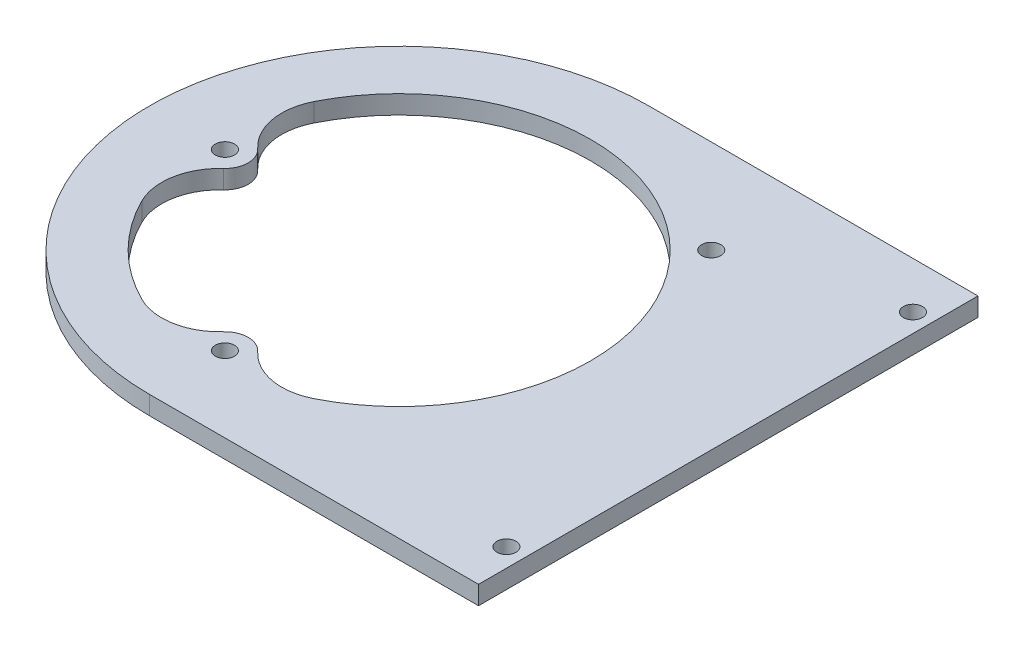
ISO-10303-21;
HEADER;
FILE_DESCRIPTION(('STEP AP214'),'2;1');
FILE_NAME('part.step','',(''),(''),'','','');
FILE_SCHEMA(('AUTOMOTIVE_DESIGN { 1 0 10303 214 1 1 1 1 }'));
ENDSEC;
DATA;
#1=APPLICATION_CONTEXT('core data for automotive mechanical design processes');
#2=APPLICATION_PROTOCOL_DEFINITION('international standard','automotive_design',2000,#1);
#3=PRODUCT_CONTEXT('',#1,'mechanical');
#4=PRODUCT('Part','Part','',(#3));
#5=PRODUCT_RELATED_PRODUCT_CATEGORY('part','',(#4));
#6=PRODUCT_DEFINITION_FORMATION('','',#4);
#7=PRODUCT_DEFINITION_CONTEXT('part definition',#1,'design');
#8=PRODUCT_DEFINITION('design','',#6,#7);
#9=PRODUCT_DEFINITION_SHAPE('','',#8);
#10=(LENGTH_UNIT() NAMED_UNIT(*) SI_UNIT(.MILLI.,.METRE.));
#11=(NAMED_UNIT(*) PLANE_ANGLE_UNIT() SI_UNIT($,.RADIAN.));
#12=(NAMED_UNIT(*) SI_UNIT($,.STERADIAN.) SOLID_ANGLE_UNIT());
#13=UNCERTAINTY_MEASURE_WITH_UNIT(LENGTH_MEASURE(1.E-05),#10,'distance_accuracy_value','');
#14=(GEOMETRIC_REPRESENTATION_CONTEXT(3) GLOBAL_UNCERTAINTY_ASSIGNED_CONTEXT((#13)) GLOBAL_UNIT_ASSIGNED_CONTEXT((#10,
#11,#12)) REPRESENTATION_CONTEXT('',''));
#15=CARTESIAN_POINT('',(0.,0.,0.));
#16=DIRECTION('',(0.,0.,1.));
#17=DIRECTION('',(1.,0.,0.));
#18=AXIS2_PLACEMENT_3D('',#15,#16,#17);
#19=CARTESIAN_POINT('',(0.,3.2,0.));
#20=DIRECTION('',(0.,1.,0.));
#21=DIRECTION('',(0.,0.,1.));
#22=AXIS2_PLACEMENT_3D('',#19,#20,#21);
#23=PLANE('',#22);
#24=CARTESIAN_POINT('',(53.47,3.2,35.));
#25=DIRECTION('',(0.,1.,0.));
#26=DIRECTION('',(0.,0.,-1.));
#27=AXIS2_PLACEMENT_3D('',#24,#25,#26);
#28=CIRCLE('',#27,1.65);
#29=CARTESIAN_POINT('',(53.47,3.2,33.35));
#30=VERTEX_POINT('',#29);
#31=EDGE_CURVE('E361',#30,#30,#28,.T.);
#32=ORIENTED_EDGE('',*,*,#31,.F.);
#33=EDGE_LOOP('',(#32));
#34=FACE_BOUND('',#33,.T.);
#35=CARTESIAN_POINT('',(-30.,3.2,0.));
#36=DIRECTION('',(0.,-1.,0.));
#37=DIRECTION('',(0.,0.,-1.));
#38=AXIS2_PLACEMENT_3D('',#35,#36,#37);
#39=CIRCLE('',#38,4.);
#40=CARTESIAN_POINT('',(-27.3,3.2,-2.95127091267474));
#41=VERTEX_POINT('',#40);
#42=CARTESIAN_POINT('',(-27.3,3.2,2.95127091267474));
#43=VERTEX_POINT('',#42);
#44=EDGE_CURVE('E239',#41,#43,#39,.T.);
#45=ORIENTED_EDGE('',*,*,#44,.F.);
#46=CARTESIAN_POINT('',(-20.55,3.2,-10.3294481943616));
#47=DIRECTION('',(0.,1.,0.));
#48=DIRECTION('',(0.,0.,1.));
#49=AXIS2_PLACEMENT_3D('',#46,#47,#48);
#50=CIRCLE('',#49,10.);
#51=CARTESIAN_POINT('',(-29.4847826086956,3.2,-14.8205126266927));
#52=VERTEX_POINT('',#51);
#53=EDGE_CURVE('E193',#41,#52,#50,.F.);
#54=ORIENTED_EDGE('',*,*,#53,.T.);
#55=CARTESIAN_POINT('',(0.,3.2,0.));
#56=DIRECTION('',(0.,1.,0.));
#57=DIRECTION('',(0.,0.,-1.));
#58=AXIS2_PLACEMENT_3D('',#55,#56,#57);
#59=CIRCLE('',#58,33.);
#60=CARTESIAN_POINT('',(14.8205126266927,3.2,29.4847826086957));
#61=VERTEX_POINT('',#60);
#62=EDGE_CURVE('E224',#61,#52,#59,.T.);
#63=ORIENTED_EDGE('',*,*,#62,.F.);
#64=CARTESIAN_POINT('',(10.3294481943616,3.2,20.55));
#65=DIRECTION('',(0.,1.,0.));
#66=DIRECTION('',(0.,0.,1.));
#67=AXIS2_PLACEMENT_3D('',#64,#65,#66);
#68=CIRCLE('',#67,10.);
#69=CARTESIAN_POINT('',(2.95127091267474,3.2,27.3));
#70=VERTEX_POINT('',#69);
#71=EDGE_CURVE('E11',#61,#70,#68,.F.);
#72=ORIENTED_EDGE('',*,*,#71,.T.);
#73=CARTESIAN_POINT('',(0.,3.2,30.));
#74=DIRECTION('',(0.,-1.,0.));
#75=DIRECTION('',(0.,0.,-1.));
#76=AXIS2_PLACEMENT_3D('',#73,#74,#75);
#77=CIRCLE('',#76,4.);
#78=CARTESIAN_POINT('',(-2.95127091267474,3.2,27.3));
#79=VERTEX_POINT('',#78);
#80=EDGE_CURVE('E227',#79,#70,#77,.T.);
#81=ORIENTED_EDGE('',*,*,#80,.F.);
#82=CARTESIAN_POINT('',(-10.3294481943616,3.2,20.55));
#83=DIRECTION('',(0.,1.,0.));
#84=DIRECTION('',(0.,0.,1.));
#85=AXIS2_PLACEMENT_3D('',#82,#83,#84);
#86=CIRCLE('',#85,10.);
#87=CARTESIAN_POINT('',(-14.8205126266927,3.2,29.4847826086956));
#88=VERTEX_POINT('',#87);
#89=EDGE_CURVE('E205',#79,#88,#86,.F.);
#90=ORIENTED_EDGE('',*,*,#89,.T.);
#91=CARTESIAN_POINT('',(0.,3.2,0.));
#92=DIRECTION('',(0.,1.,0.));
#93=DIRECTION('',(0.,0.,-1.));
#94=AXIS2_PLACEMENT_3D('',#91,#92,#93);
#95=CIRCLE('',#94,33.);
#96=CARTESIAN_POINT('',(-29.4847826086957,3.2,14.8205126266927));
#97=VERTEX_POINT('',#96);
#98=EDGE_CURVE('E231',#97,#88,#95,.T.);
#99=ORIENTED_EDGE('',*,*,#98,.F.);
#100=CARTESIAN_POINT('',(-20.55,3.2,10.3294481943616));
#101=DIRECTION('',(0.,1.,0.));
#102=DIRECTION('',(0.,0.,1.));
#103=AXIS2_PLACEMENT_3D('',#100,#101,#102);
#104=CIRCLE('',#103,10.);
#105=EDGE_CURVE('E199',#97,#43,#104,.F.);
#106=ORIENTED_EDGE('',*,*,#105,.T.);
#107=EDGE_LOOP('',(#45,#54,#63,#72,#81,#90,#99,#106));
#108=FACE_BOUND('',#107,.T.);
#109=CARTESIAN_POINT('',(0.,3.2,30.));
#110=DIRECTION('',(0.,1.,0.));
#111=DIRECTION('',(0.,0.,1.));
#112=AXIS2_PLACEMENT_3D('',#109,#110,#111);
#113=CIRCLE('',#112,1.65);
#114=CARTESIAN_POINT('',(0.,3.2,31.65));
#115=VERTEX_POINT('',#114);
#116=EDGE_CURVE('E236',#115,#115,#113,.T.);
#117=ORIENTED_EDGE('',*,*,#116,.F.);
#118=EDGE_LOOP('',(#117));
#119=FACE_BOUND('',#118,.T.);
#120=CARTESIAN_POINT('',(0.,3.2,0.));
#121=DIRECTION('',(0.,1.,0.));
#122=DIRECTION('',(0.,0.,1.));
#123=AXIS2_PLACEMENT_3D('',#120,#121,#122);
#124=CIRCLE('',#123,43.);
#125=CARTESIAN_POINT('',(0.,3.2,-43.));
#126=VERTEX_POINT('',#125);
#127=CARTESIAN_POINT('',(0.,3.2,43.));
#128=VERTEX_POINT('',#127);
#129=EDGE_CURVE('E141',#126,#128,#124,.T.);
#130=ORIENTED_EDGE('',*,*,#129,.T.);
#131=DIRECTION('',(1.,0.,0.));
#132=VECTOR('',#131,1.);
#133=CARTESIAN_POINT('',(0.,3.2,43.));
#134=LINE('',#133,#132);
#135=CARTESIAN_POINT('',(56.67,3.2,43.));
#136=VERTEX_POINT('',#135);
#137=EDGE_CURVE('E129',#128,#136,#134,.T.);
#138=ORIENTED_EDGE('',*,*,#137,.T.);
#139=DIRECTION('',(0.,0.,-1.));
#140=VECTOR('',#139,1.);
#141=CARTESIAN_POINT('',(56.67,3.2,43.));
#142=LINE('',#141,#140);
#143=CARTESIAN_POINT('',(56.67,3.2,-43.));
#144=VERTEX_POINT('',#143);
#145=EDGE_CURVE('E140',#136,#144,#142,.T.);
#146=ORIENTED_EDGE('',*,*,#145,.T.);
#147=DIRECTION('',(-1.,0.,0.));
#148=VECTOR('',#147,1.);
#149=CARTESIAN_POINT('',(56.67,3.2,-43.));
#150=LINE('',#149,#148);
#151=EDGE_CURVE('E146',#144,#126,#150,.T.);
#152=ORIENTED_EDGE('',*,*,#151,.T.);
#153=EDGE_LOOP('',(#130,#138,#146,#152));
#154=FACE_BOUND('',#153,.T.);
#155=CARTESIAN_POINT('',(26.8700576850888,3.2,-26.8700576850889));
#156=DIRECTION('',(0.,1.,0.));
#157=DIRECTION('',(0.,0.,1.));
#158=AXIS2_PLACEMENT_3D('',#155,#156,#157);
#159=CIRCLE('',#158,1.65);
#160=CARTESIAN_POINT('',(26.8700576850888,3.2,-25.2200576850889));
#161=VERTEX_POINT('',#160);
#162=EDGE_CURVE('E258',#161,#161,#159,.T.);
#163=ORIENTED_EDGE('',*,*,#162,.F.);
#164=EDGE_LOOP('',(#163));
#165=FACE_BOUND('',#164,.T.);
#166=CARTESIAN_POINT('',(53.47,3.2,-35.));
#167=DIRECTION('',(0.,1.,0.));
#168=DIRECTION('',(0.,0.,1.));
#169=AXIS2_PLACEMENT_3D('',#166,#167,#168);
#170=CIRCLE('',#169,1.65);
#171=CARTESIAN_POINT('',(53.47,3.2,-33.35));
#172=VERTEX_POINT('',#171);
#173=EDGE_CURVE('E248',#172,#172,#170,.T.);
#174=ORIENTED_EDGE('',*,*,#173,.F.);
#175=EDGE_LOOP('',(#174));
#176=FACE_BOUND('',#175,.T.);
#177=CARTESIAN_POINT('',(-30.,3.2,0.));
#178=DIRECTION('',(0.,1.,0.));
#179=DIRECTION('',(0.,0.,-1.));
#180=AXIS2_PLACEMENT_3D('',#177,#178,#179);
#181=CIRCLE('',#180,1.65);
#182=CARTESIAN_POINT('',(-30.,3.2,-1.65));
#183=VERTEX_POINT('',#182);
#184=EDGE_CURVE('E350',#183,#183,#181,.T.);
#185=ORIENTED_EDGE('',*,*,#184,.F.);
#186=EDGE_LOOP('',(#185));
#187=FACE_BOUND('',#186,.T.);
#188=ADVANCED_FACE('F39',(#34,#108,#119,#154,#165,#176,#187),#23,.T.);
#189=CARTESIAN_POINT('',(0.,0.,0.));
#190=DIRECTION('',(0.,1.,0.));
#191=DIRECTION('',(0.,0.,1.));
#192=AXIS2_PLACEMENT_3D('',#189,#190,#191);
#193=PLANE('',#192);
#194=CARTESIAN_POINT('',(0.,0.,30.));
#195=DIRECTION('',(0.,1.,0.));
#196=DIRECTION('',(0.,0.,1.));
#197=AXIS2_PLACEMENT_3D('',#194,#195,#196);
#198=CIRCLE('',#197,1.65);
#199=CARTESIAN_POINT('',(0.,0.,31.65));
#200=VERTEX_POINT('',#199);
#201=EDGE_CURVE('E230',#200,#200,#198,.T.);
#202=ORIENTED_EDGE('',*,*,#201,.T.);
#203=EDGE_LOOP('',(#202));
#204=FACE_BOUND('',#203,.T.);
#205=CARTESIAN_POINT('',(26.8700576850888,0.,-26.8700576850889));
#206=DIRECTION('',(0.,1.,0.));
#207=DIRECTION('',(0.,0.,1.));
#208=AXIS2_PLACEMENT_3D('',#205,#206,#207);
#209=CIRCLE('',#208,1.65);
#210=CARTESIAN_POINT('',(26.8700576850888,0.,-25.2200576850889));
#211=VERTEX_POINT('',#210);
#212=EDGE_CURVE('E256',#211,#211,#209,.T.);
#213=ORIENTED_EDGE('',*,*,#212,.T.);
#214=EDGE_LOOP('',(#213));
#215=FACE_BOUND('',#214,.T.);
#216=CARTESIAN_POINT('',(0.,0.,0.));
#217=DIRECTION('',(0.,1.,0.));
#218=DIRECTION('',(0.,0.,1.));
#219=AXIS2_PLACEMENT_3D('',#216,#217,#218);
#220=CIRCLE('',#219,43.);
#221=CARTESIAN_POINT('',(0.,0.,-43.));
#222=VERTEX_POINT('',#221);
#223=CARTESIAN_POINT('',(0.,0.,43.));
#224=VERTEX_POINT('',#223);
#225=EDGE_CURVE('E155',#222,#224,#220,.T.);
#226=ORIENTED_EDGE('',*,*,#225,.F.);
#227=DIRECTION('',(-1.,0.,0.));
#228=VECTOR('',#227,1.);
#229=CARTESIAN_POINT('',(56.67,0.,-43.));
#230=LINE('',#229,#228);
#231=CARTESIAN_POINT('',(56.67,0.,-43.));
#232=VERTEX_POINT('',#231);
#233=EDGE_CURVE('E151',#232,#222,#230,.T.);
#234=ORIENTED_EDGE('',*,*,#233,.F.);
#235=DIRECTION('',(0.,0.,-1.));
#236=VECTOR('',#235,1.);
#237=CARTESIAN_POINT('',(56.67,0.,43.));
#238=LINE('',#237,#236);
#239=CARTESIAN_POINT('',(56.67,0.,43.));
#240=VERTEX_POINT('',#239);
#241=EDGE_CURVE('E275',#240,#232,#238,.T.);
#242=ORIENTED_EDGE('',*,*,#241,.F.);
#243=DIRECTION('',(1.,0.,0.));
#244=VECTOR('',#243,1.);
#245=CARTESIAN_POINT('',(0.,0.,43.));
#246=LINE('',#245,#244);
#247=EDGE_CURVE('E272',#224,#240,#246,.T.);
#248=ORIENTED_EDGE('',*,*,#247,.F.);
#249=EDGE_LOOP('',(#226,#234,#242,#248));
#250=FACE_BOUND('',#249,.T.);
#251=CARTESIAN_POINT('',(0.,0.,0.));
#252=DIRECTION('',(0.,1.,0.));
#253=DIRECTION('',(0.,0.,1.));
#254=AXIS2_PLACEMENT_3D('',#251,#252,#253);
#255=CIRCLE('',#254,33.);
#256=CARTESIAN_POINT('',(14.8205126266927,0.,29.4847826086957));
#257=VERTEX_POINT('',#256);
#258=CARTESIAN_POINT('',(-29.4847826086956,0.,-14.8205126266927));
#259=VERTEX_POINT('',#258);
#260=EDGE_CURVE('E214',#257,#259,#255,.T.);
#261=ORIENTED_EDGE('',*,*,#260,.T.);
#262=CARTESIAN_POINT('',(-20.55,0.,-10.3294481943616));
#263=DIRECTION('',(0.,1.,0.));
#264=DIRECTION('',(0.,0.,1.));
#265=AXIS2_PLACEMENT_3D('',#262,#263,#264);
#266=CIRCLE('',#265,10.);
#267=CARTESIAN_POINT('',(-27.3,0.,-2.95127091267474));
#268=VERTEX_POINT('',#267);
#269=EDGE_CURVE('E190',#259,#268,#266,.T.);
#270=ORIENTED_EDGE('',*,*,#269,.T.);
#271=CARTESIAN_POINT('',(-30.,0.,0.));
#272=DIRECTION('',(0.,-1.,0.));
#273=DIRECTION('',(0.,0.,-1.));
#274=AXIS2_PLACEMENT_3D('',#271,#272,#273);
#275=CIRCLE('',#274,4.);
#276=CARTESIAN_POINT('',(-27.3,0.,2.95127091267474));
#277=VERTEX_POINT('',#276);
#278=EDGE_CURVE('E243',#268,#277,#275,.T.);
#279=ORIENTED_EDGE('',*,*,#278,.T.);
#280=CARTESIAN_POINT('',(-20.55,0.,10.3294481943616));
#281=DIRECTION('',(0.,1.,0.));
#282=DIRECTION('',(0.,0.,1.));
#283=AXIS2_PLACEMENT_3D('',#280,#281,#282);
#284=CIRCLE('',#283,10.);
#285=CARTESIAN_POINT('',(-29.4847826086957,0.,14.8205126266927));
#286=VERTEX_POINT('',#285);
#287=EDGE_CURVE('E196',#277,#286,#284,.T.);
#288=ORIENTED_EDGE('',*,*,#287,.T.);
#289=CARTESIAN_POINT('',(0.,0.,0.));
#290=DIRECTION('',(0.,1.,0.));
#291=DIRECTION('',(0.,0.,-1.));
#292=AXIS2_PLACEMENT_3D('',#289,#290,#291);
#293=CIRCLE('',#292,33.);
#294=CARTESIAN_POINT('',(-14.8205126266927,0.,29.4847826086956));
#295=VERTEX_POINT('',#294);
#296=EDGE_CURVE('E247',#286,#295,#293,.T.);
#297=ORIENTED_EDGE('',*,*,#296,.T.);
#298=CARTESIAN_POINT('',(-10.3294481943616,0.,20.55));
#299=DIRECTION('',(0.,1.,0.));
#300=DIRECTION('',(0.,0.,1.));
#301=AXIS2_PLACEMENT_3D('',#298,#299,#300);
#302=CIRCLE('',#301,10.);
#303=CARTESIAN_POINT('',(-2.95127091267474,0.,27.3));
#304=VERTEX_POINT('',#303);
#305=EDGE_CURVE('E202',#295,#304,#302,.T.);
#306=ORIENTED_EDGE('',*,*,#305,.T.);
#307=CARTESIAN_POINT('',(0.,0.,30.));
#308=DIRECTION('',(0.,-1.,0.));
#309=DIRECTION('',(0.,0.,-1.));
#310=AXIS2_PLACEMENT_3D('',#307,#308,#309);
#311=CIRCLE('',#310,4.);
#312=CARTESIAN_POINT('',(2.95127091267474,0.,27.3));
#313=VERTEX_POINT('',#312);
#314=EDGE_CURVE('E215',#304,#313,#311,.T.);
#315=ORIENTED_EDGE('',*,*,#314,.T.);
#316=CARTESIAN_POINT('',(10.3294481943616,0.,20.55));
#317=DIRECTION('',(0.,1.,0.));
#318=DIRECTION('',(0.,0.,1.));
#319=AXIS2_PLACEMENT_3D('',#316,#317,#318);
#320=CIRCLE('',#319,10.);
#321=EDGE_CURVE('E48',#313,#257,#320,.T.);
#322=ORIENTED_EDGE('',*,*,#321,.T.);
#323=EDGE_LOOP('',(#261,#270,#279,#288,#297,#306,#315,#322));
#324=FACE_BOUND('',#323,.T.);
#325=CARTESIAN_POINT('',(53.47,0.,-35.));
#326=DIRECTION('',(0.,1.,0.));
#327=DIRECTION('',(0.,0.,1.));
#328=AXIS2_PLACEMENT_3D('',#325,#326,#327);
#329=CIRCLE('',#328,1.65);
#330=CARTESIAN_POINT('',(53.47,0.,-33.35));
#331=VERTEX_POINT('',#330);
#332=EDGE_CURVE('E365',#331,#331,#329,.T.);
#333=ORIENTED_EDGE('',*,*,#332,.T.);
#334=EDGE_LOOP('',(#333));
#335=FACE_BOUND('',#334,.T.);
#336=CARTESIAN_POINT('',(53.47,0.,35.));
#337=DIRECTION('',(0.,1.,0.));
#338=DIRECTION('',(0.,0.,-1.));
#339=AXIS2_PLACEMENT_3D('',#336,#337,#338);
#340=CIRCLE('',#339,1.65);
#341=CARTESIAN_POINT('',(53.47,0.,33.35));
#342=VERTEX_POINT('',#341);
#343=EDGE_CURVE('E358',#342,#342,#340,.T.);
#344=ORIENTED_EDGE('',*,*,#343,.T.);
#345=EDGE_LOOP('',(#344));
#346=FACE_BOUND('',#345,.T.);
#347=CARTESIAN_POINT('',(-30.,0.,0.));
#348=DIRECTION('',(0.,1.,0.));
#349=DIRECTION('',(0.,0.,-1.));
#350=AXIS2_PLACEMENT_3D('',#347,#348,#349);
#351=CIRCLE('',#350,1.65);
#352=CARTESIAN_POINT('',(-30.,0.,-1.65));
#353=VERTEX_POINT('',#352);
#354=EDGE_CURVE('E353',#353,#353,#351,.T.);
#355=ORIENTED_EDGE('',*,*,#354,.T.);
#356=EDGE_LOOP('',(#355));
#357=FACE_BOUND('',#356,.T.);
#358=ADVANCED_FACE('F212',(#204,#215,#250,#324,#335,#346,#357),#193,.F.);
#359=CARTESIAN_POINT('',(0.,3.2,0.));
#360=DIRECTION('',(0.,-1.,0.));
#361=DIRECTION('',(0.,0.,-1.));
#362=AXIS2_PLACEMENT_3D('',#359,#360,#361);
#363=CYLINDRICAL_SURFACE('',#362,43.);
#364=ORIENTED_EDGE('',*,*,#225,.T.);
#365=DIRECTION('',(0.,-1.,0.));
#366=VECTOR('',#365,1.);
#367=CARTESIAN_POINT('',(0.,3.2,43.));
#368=LINE('',#367,#366);
#369=EDGE_CURVE('E133',#128,#224,#368,.T.);
#370=ORIENTED_EDGE('',*,*,#369,.F.);
#371=ORIENTED_EDGE('',*,*,#129,.F.);
#372=DIRECTION('',(0.,-1.,0.));
#373=VECTOR('',#372,1.);
#374=CARTESIAN_POINT('',(0.,3.2,-43.));
#375=LINE('',#374,#373);
#376=EDGE_CURVE('E269',#126,#222,#375,.T.);
#377=ORIENTED_EDGE('',*,*,#376,.T.);
#378=EDGE_LOOP('',(#364,#370,#371,#377));
#379=FACE_BOUND('',#378,.T.);
#380=ADVANCED_FACE('F153',(#379),#363,.T.);
#381=CARTESIAN_POINT('',(0.,3.2,43.));
#382=DIRECTION('',(0.,0.,-1.));
#383=DIRECTION('',(-1.,0.,0.));
#384=AXIS2_PLACEMENT_3D('',#381,#382,#383);
#385=PLANE('',#384);
#386=ORIENTED_EDGE('',*,*,#247,.T.);
#387=DIRECTION('',(0.,-1.,0.));
#388=VECTOR('',#387,1.);
#389=CARTESIAN_POINT('',(56.67,3.2,43.));
#390=LINE('',#389,#388);
#391=EDGE_CURVE('E136',#136,#240,#390,.T.);
#392=ORIENTED_EDGE('',*,*,#391,.F.);
#393=ORIENTED_EDGE('',*,*,#137,.F.);
#394=ORIENTED_EDGE('',*,*,#369,.T.);
#395=EDGE_LOOP('',(#386,#392,#393,#394));
#396=FACE_BOUND('',#395,.T.);
#397=ADVANCED_FACE('F131',(#396),#385,.F.);
#398=CARTESIAN_POINT('',(56.67,3.2,43.));
#399=DIRECTION('',(-1.,0.,0.));
#400=DIRECTION('',(0.,0.,1.));
#401=AXIS2_PLACEMENT_3D('',#398,#399,#400);
#402=PLANE('',#401);
#403=ORIENTED_EDGE('',*,*,#241,.T.);
#404=DIRECTION('',(0.,-1.,0.));
#405=VECTOR('',#404,1.);
#406=CARTESIAN_POINT('',(56.67,3.2,-43.));
#407=LINE('',#406,#405);
#408=EDGE_CURVE('E163',#144,#232,#407,.T.);
#409=ORIENTED_EDGE('',*,*,#408,.F.);
#410=ORIENTED_EDGE('',*,*,#145,.F.);
#411=ORIENTED_EDGE('',*,*,#391,.T.);
#412=EDGE_LOOP('',(#403,#409,#410,#411));
#413=FACE_BOUND('',#412,.T.);
#414=ADVANCED_FACE('F290',(#413),#402,.F.);
#415=CARTESIAN_POINT('',(56.67,3.2,-43.));
#416=DIRECTION('',(0.,0.,1.));
#417=DIRECTION('',(1.,0.,0.));
#418=AXIS2_PLACEMENT_3D('',#415,#416,#417);
#419=PLANE('',#418);
#420=ORIENTED_EDGE('',*,*,#233,.T.);
#421=ORIENTED_EDGE('',*,*,#376,.F.);
#422=ORIENTED_EDGE('',*,*,#151,.F.);
#423=ORIENTED_EDGE('',*,*,#408,.T.);
#424=EDGE_LOOP('',(#420,#421,#422,#423));
#425=FACE_BOUND('',#424,.T.);
#426=ADVANCED_FACE('F286',(#425),#419,.F.);
#427=CARTESIAN_POINT('',(26.8700576850888,3.2,-26.8700576850889));
#428=DIRECTION('',(0.,-1.,0.));
#429=DIRECTION('',(0.,0.,-1.));
#430=AXIS2_PLACEMENT_3D('',#427,#428,#429);
#431=CYLINDRICAL_SURFACE('',#430,1.65);
#432=ORIENTED_EDGE('',*,*,#162,.T.);
#433=EDGE_LOOP('',(#432));
#434=FACE_BOUND('',#433,.T.);
#435=ORIENTED_EDGE('',*,*,#212,.F.);
#436=EDGE_LOOP('',(#435));
#437=FACE_BOUND('',#436,.T.);
#438=ADVANCED_FACE('F297',(#434,#437),#431,.F.);
#439=CARTESIAN_POINT('',(0.,3.2,30.));
#440=DIRECTION('',(0.,-1.,0.));
#441=DIRECTION('',(0.,0.,-1.));
#442=AXIS2_PLACEMENT_3D('',#439,#440,#441);
#443=CYLINDRICAL_SURFACE('',#442,1.65);
#444=ORIENTED_EDGE('',*,*,#116,.T.);
#445=EDGE_LOOP('',(#444));
#446=FACE_BOUND('',#445,.T.);
#447=ORIENTED_EDGE('',*,*,#201,.F.);
#448=EDGE_LOOP('',(#447));
#449=FACE_BOUND('',#448,.T.);
#450=ADVANCED_FACE('F312',(#446,#449),#443,.F.);
#451=CARTESIAN_POINT('',(-30.,3.2,0.));
#452=DIRECTION('',(0.,-1.,0.));
#453=DIRECTION('',(0.,0.,-1.));
#454=AXIS2_PLACEMENT_3D('',#451,#452,#453);
#455=CYLINDRICAL_SURFACE('',#454,4.);
#456=ORIENTED_EDGE('',*,*,#278,.F.);
#457=DIRECTION('',(0.,-1.,0.));
#458=VECTOR('',#457,1.);
#459=CARTESIAN_POINT('',(-27.3,3.2,-2.95127091267474));
#460=LINE('',#459,#458);
#461=EDGE_CURVE('E174',#268,#41,#460,.F.);
#462=ORIENTED_EDGE('',*,*,#461,.T.);
#463=ORIENTED_EDGE('',*,*,#44,.T.);
#464=DIRECTION('',(0.,-1.,0.));
#465=VECTOR('',#464,1.);
#466=CARTESIAN_POINT('',(-27.3,3.2,2.95127091267474));
#467=LINE('',#466,#465);
#468=EDGE_CURVE('E170',#43,#277,#467,.T.);
#469=ORIENTED_EDGE('',*,*,#468,.T.);
#470=EDGE_LOOP('',(#456,#462,#463,#469));
#471=FACE_BOUND('',#470,.T.);
#472=ADVANCED_FACE('F316',(#471),#455,.T.);
#473=CARTESIAN_POINT('',(0.,3.2,0.));
#474=DIRECTION('',(0.,-1.,0.));
#475=DIRECTION('',(0.,0.,-1.));
#476=AXIS2_PLACEMENT_3D('',#473,#474,#475);
#477=CYLINDRICAL_SURFACE('',#476,33.);
#478=ORIENTED_EDGE('',*,*,#296,.F.);
#479=DIRECTION('',(0.,-1.,0.));
#480=VECTOR('',#479,1.);
#481=CARTESIAN_POINT('',(-29.4847826086957,3.2,14.8205126266927));
#482=LINE('',#481,#480);
#483=EDGE_CURVE('E181',#286,#97,#482,.F.);
#484=ORIENTED_EDGE('',*,*,#483,.T.);
#485=ORIENTED_EDGE('',*,*,#98,.T.);
#486=DIRECTION('',(0.,-1.,0.));
#487=VECTOR('',#486,1.);
#488=CARTESIAN_POINT('',(-14.8205126266927,3.2,29.4847826086956));
#489=LINE('',#488,#487);
#490=EDGE_CURVE('E177',#88,#295,#489,.T.);
#491=ORIENTED_EDGE('',*,*,#490,.T.);
#492=EDGE_LOOP('',(#478,#484,#485,#491));
#493=FACE_BOUND('',#492,.T.);
#494=ADVANCED_FACE('F320',(#493),#477,.F.);
#495=CARTESIAN_POINT('',(0.,3.2,30.));
#496=DIRECTION('',(0.,-1.,0.));
#497=DIRECTION('',(0.,0.,-1.));
#498=AXIS2_PLACEMENT_3D('',#495,#496,#497);
#499=CYLINDRICAL_SURFACE('',#498,4.);
#500=ORIENTED_EDGE('',*,*,#314,.F.);
#501=DIRECTION('',(0.,-1.,0.));
#502=VECTOR('',#501,1.);
#503=CARTESIAN_POINT('',(-2.95127091267474,3.2,27.3));
#504=LINE('',#503,#502);
#505=EDGE_CURVE('E60',#304,#79,#504,.F.);
#506=ORIENTED_EDGE('',*,*,#505,.T.);
#507=ORIENTED_EDGE('',*,*,#80,.T.);
#508=DIRECTION('',(0.,-1.,0.));
#509=VECTOR('',#508,1.);
#510=CARTESIAN_POINT('',(2.95127091267474,3.2,27.3));
#511=LINE('',#510,#509);
#512=EDGE_CURVE('E184',#70,#313,#511,.T.);
#513=ORIENTED_EDGE('',*,*,#512,.T.);
#514=EDGE_LOOP('',(#500,#506,#507,#513));
#515=FACE_BOUND('',#514,.T.);
#516=ADVANCED_FACE('F226',(#515),#499,.T.);
#517=CARTESIAN_POINT('',(0.,3.2,0.));
#518=DIRECTION('',(0.,-1.,0.));
#519=DIRECTION('',(0.,0.,-1.));
#520=AXIS2_PLACEMENT_3D('',#517,#518,#519);
#521=CYLINDRICAL_SURFACE('',#520,33.);
#522=ORIENTED_EDGE('',*,*,#62,.T.);
#523=DIRECTION('',(0.,-1.,0.));
#524=VECTOR('',#523,1.);
#525=CARTESIAN_POINT('',(-29.4847826086956,3.2,-14.8205126266927));
#526=LINE('',#525,#524);
#527=EDGE_CURVE('E161',#52,#259,#526,.T.);
#528=ORIENTED_EDGE('',*,*,#527,.T.);
#529=ORIENTED_EDGE('',*,*,#260,.F.);
#530=DIRECTION('',(0.,-1.,0.));
#531=VECTOR('',#530,1.);
#532=CARTESIAN_POINT('',(14.8205126266927,3.2,29.4847826086957));
#533=LINE('',#532,#531);
#534=EDGE_CURVE('E157',#257,#61,#533,.F.);
#535=ORIENTED_EDGE('',*,*,#534,.T.);
#536=EDGE_LOOP('',(#522,#528,#529,#535));
#537=FACE_BOUND('',#536,.T.);
#538=ADVANCED_FACE('F221',(#537),#521,.F.);
#539=CARTESIAN_POINT('',(53.47,3.2,-35.));
#540=DIRECTION('',(0.,-1.,0.));
#541=DIRECTION('',(0.,0.,-1.));
#542=AXIS2_PLACEMENT_3D('',#539,#540,#541);
#543=CYLINDRICAL_SURFACE('',#542,1.65);
#544=ORIENTED_EDGE('',*,*,#173,.T.);
#545=EDGE_LOOP('',(#544));
#546=FACE_BOUND('',#545,.T.);
#547=ORIENTED_EDGE('',*,*,#332,.F.);
#548=EDGE_LOOP('',(#547));
#549=FACE_BOUND('',#548,.T.);
#550=ADVANCED_FACE('F329',(#546,#549),#543,.F.);
#551=CARTESIAN_POINT('',(53.47,3.2,35.));
#552=DIRECTION('',(0.,-1.,0.));
#553=DIRECTION('',(0.,0.,-1.));
#554=AXIS2_PLACEMENT_3D('',#551,#552,#553);
#555=CYLINDRICAL_SURFACE('',#554,1.65);
#556=ORIENTED_EDGE('',*,*,#31,.T.);
#557=EDGE_LOOP('',(#556));
#558=FACE_BOUND('',#557,.T.);
#559=ORIENTED_EDGE('',*,*,#343,.F.);
#560=EDGE_LOOP('',(#559));
#561=FACE_BOUND('',#560,.T.);
#562=ADVANCED_FACE('F332',(#558,#561),#555,.F.);
#563=CARTESIAN_POINT('',(-30.,3.2,0.));
#564=DIRECTION('',(0.,-1.,0.));
#565=DIRECTION('',(0.,0.,-1.));
#566=AXIS2_PLACEMENT_3D('',#563,#564,#565);
#567=CYLINDRICAL_SURFACE('',#566,1.65);
#568=ORIENTED_EDGE('',*,*,#184,.T.);
#569=EDGE_LOOP('',(#568));
#570=FACE_BOUND('',#569,.T.);
#571=ORIENTED_EDGE('',*,*,#354,.F.);
#572=EDGE_LOOP('',(#571));
#573=FACE_BOUND('',#572,.T.);
#574=ADVANCED_FACE('F336',(#570,#573),#567,.F.);
#575=CARTESIAN_POINT('',(-20.55,3.2,-10.3294481943616));
#576=DIRECTION('',(0.,-1.,0.));
#577=DIRECTION('',(0.,0.,-1.));
#578=AXIS2_PLACEMENT_3D('',#575,#576,#577);
#579=CYLINDRICAL_SURFACE('',#578,10.);
#580=ORIENTED_EDGE('',*,*,#53,.F.);
#581=ORIENTED_EDGE('',*,*,#461,.F.);
#582=ORIENTED_EDGE('',*,*,#269,.F.);
#583=ORIENTED_EDGE('',*,*,#527,.F.);
#584=EDGE_LOOP('',(#580,#581,#582,#583));
#585=FACE_BOUND('',#584,.T.);
#586=ADVANCED_FACE('F339',(#585),#579,.F.);
#587=CARTESIAN_POINT('',(-20.55,3.2,10.3294481943616));
#588=DIRECTION('',(0.,-1.,0.));
#589=DIRECTION('',(0.,0.,-1.));
#590=AXIS2_PLACEMENT_3D('',#587,#588,#589);
#591=CYLINDRICAL_SURFACE('',#590,10.);
#592=ORIENTED_EDGE('',*,*,#105,.F.);
#593=ORIENTED_EDGE('',*,*,#483,.F.);
#594=ORIENTED_EDGE('',*,*,#287,.F.);
#595=ORIENTED_EDGE('',*,*,#468,.F.);
#596=EDGE_LOOP('',(#592,#593,#594,#595));
#597=FACE_BOUND('',#596,.T.);
#598=ADVANCED_FACE('F344',(#597),#591,.F.);
#599=CARTESIAN_POINT('',(-10.3294481943616,3.2,20.55));
#600=DIRECTION('',(0.,-1.,0.));
#601=DIRECTION('',(0.,0.,-1.));
#602=AXIS2_PLACEMENT_3D('',#599,#600,#601);
#603=CYLINDRICAL_SURFACE('',#602,10.);
#604=ORIENTED_EDGE('',*,*,#89,.F.);
#605=ORIENTED_EDGE('',*,*,#505,.F.);
#606=ORIENTED_EDGE('',*,*,#305,.F.);
#607=ORIENTED_EDGE('',*,*,#490,.F.);
#608=EDGE_LOOP('',(#604,#605,#606,#607));
#609=FACE_BOUND('',#608,.T.);
#610=ADVANCED_FACE('F390',(#609),#603,.F.);
#611=CARTESIAN_POINT('',(10.3294481943616,3.2,20.55));
#612=DIRECTION('',(0.,-1.,0.));
#613=DIRECTION('',(0.,0.,-1.));
#614=AXIS2_PLACEMENT_3D('',#611,#612,#613);
#615=CYLINDRICAL_SURFACE('',#614,10.);
#616=ORIENTED_EDGE('',*,*,#71,.F.);
#617=ORIENTED_EDGE('',*,*,#534,.F.);
#618=ORIENTED_EDGE('',*,*,#321,.F.);
#619=ORIENTED_EDGE('',*,*,#512,.F.);
#620=EDGE_LOOP('',(#616,#617,#618,#619));
#621=FACE_BOUND('',#620,.T.);
#622=ADVANCED_FACE('F41',(#621),#615,.F.);
#623=CLOSED_SHELL('',(#188,#358,#380,#397,#414,#426,#438,#450,#472,#494,#516,#538,#550,#562,
#574,#586,#598,#610,#622));
#624=MANIFOLD_SOLID_BREP('B2',#623);
#625=ADVANCED_BREP_SHAPE_REPRESENTATION('',(#18,#624),#14);
#626=SHAPE_DEFINITION_REPRESENTATION(#9,#625);
ENDSEC;
END-ISO-10303-21;
